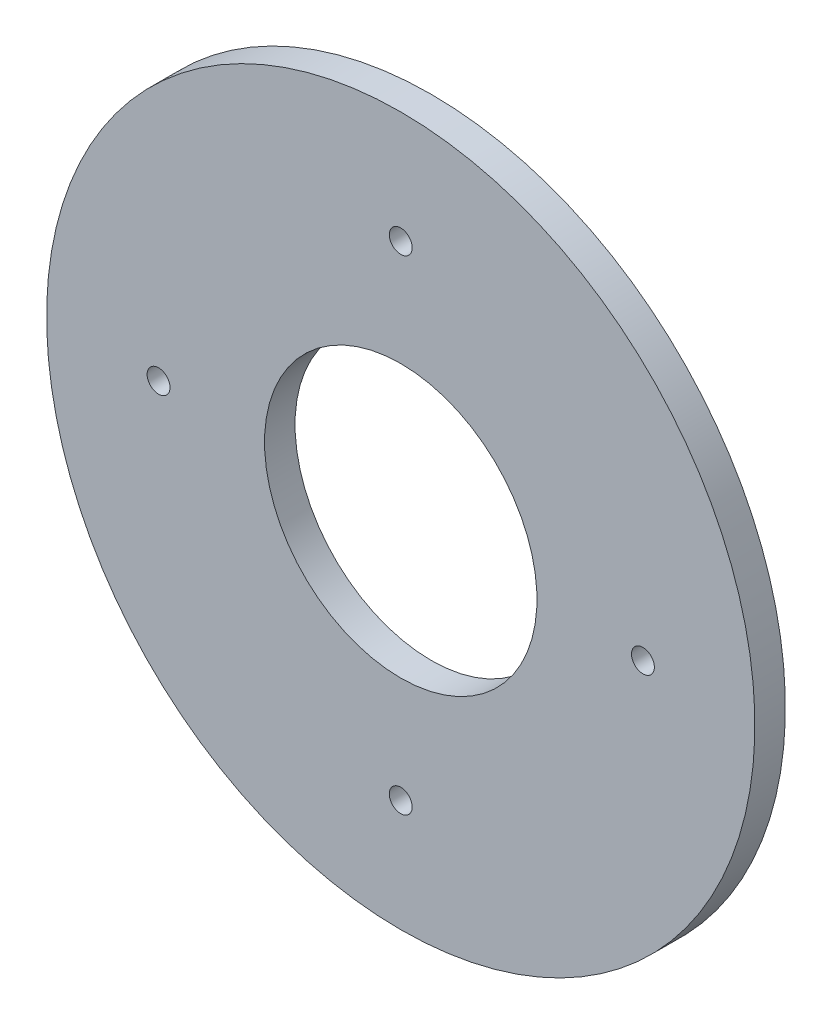
ISO-10303-21;
HEADER;
FILE_DESCRIPTION(('STEP AP214'),'2;1');
FILE_NAME('part.step','',(''),(''),'','','');
FILE_SCHEMA(('AUTOMOTIVE_DESIGN { 1 0 10303 214 1 1 1 1 }'));
ENDSEC;
DATA;
#1=APPLICATION_CONTEXT('core data for automotive mechanical design processes');
#2=APPLICATION_PROTOCOL_DEFINITION('international standard','automotive_design',2000,#1);
#3=PRODUCT_CONTEXT('',#1,'mechanical');
#4=PRODUCT('Part','Part','',(#3));
#5=PRODUCT_RELATED_PRODUCT_CATEGORY('part','',(#4));
#6=PRODUCT_DEFINITION_FORMATION('','',#4);
#7=PRODUCT_DEFINITION_CONTEXT('part definition',#1,'design');
#8=PRODUCT_DEFINITION('design','',#6,#7);
#9=PRODUCT_DEFINITION_SHAPE('','',#8);
#10=(LENGTH_UNIT() NAMED_UNIT(*) SI_UNIT(.MILLI.,.METRE.));
#11=(NAMED_UNIT(*) PLANE_ANGLE_UNIT() SI_UNIT($,.RADIAN.));
#12=(NAMED_UNIT(*) SI_UNIT($,.STERADIAN.) SOLID_ANGLE_UNIT());
#13=UNCERTAINTY_MEASURE_WITH_UNIT(LENGTH_MEASURE(1.E-05),#10,'distance_accuracy_value','');
#14=(GEOMETRIC_REPRESENTATION_CONTEXT(3) GLOBAL_UNCERTAINTY_ASSIGNED_CONTEXT((#13)) GLOBAL_UNIT_ASSIGNED_CONTEXT((#10,
#11,#12)) REPRESENTATION_CONTEXT('',''));
#15=CARTESIAN_POINT('',(0.,0.,0.));
#16=DIRECTION('',(0.,0.,1.));
#17=DIRECTION('',(1.,0.,0.));
#18=AXIS2_PLACEMENT_3D('',#15,#16,#17);
#19=CARTESIAN_POINT('',(0.,0.,5.6));
#20=DIRECTION('',(0.,0.,-1.));
#21=DIRECTION('',(0.,1.,0.));
#22=AXIS2_PLACEMENT_3D('',#19,#20,#21);
#23=PLANE('',#22);
#24=CARTESIAN_POINT('',(0.,44.45,5.60000000000002));
#25=DIRECTION('',(0.,0.,-1.));
#26=DIRECTION('',(0.,1.,0.));
#27=AXIS2_PLACEMENT_3D('',#24,#25,#26);
#28=CIRCLE('',#27,2.1);
#29=CARTESIAN_POINT('',(0.,46.55,5.60000000000002));
#30=VERTEX_POINT('',#29);
#31=EDGE_CURVE('E56',#30,#30,#28,.T.);
#32=ORIENTED_EDGE('',*,*,#31,.T.);
#33=EDGE_LOOP('',(#32));
#34=FACE_BOUND('',#33,.T.);
#35=CARTESIAN_POINT('',(-44.45,0.,5.60000000000002));
#36=DIRECTION('',(0.,0.,-1.));
#37=DIRECTION('',(0.,1.,0.));
#38=AXIS2_PLACEMENT_3D('',#35,#36,#37);
#39=CIRCLE('',#38,2.10000000000156);
#40=CARTESIAN_POINT('',(-44.45,2.10000000000157,5.60000000000002));
#41=VERTEX_POINT('',#40);
#42=EDGE_CURVE('E78',#41,#41,#39,.T.);
#43=ORIENTED_EDGE('',*,*,#42,.T.);
#44=EDGE_LOOP('',(#43));
#45=FACE_BOUND('',#44,.T.);
#46=CARTESIAN_POINT('',(0.,-44.45,5.60000000000001));
#47=DIRECTION('',(0.,0.,-1.));
#48=DIRECTION('',(0.,1.,0.));
#49=AXIS2_PLACEMENT_3D('',#46,#47,#48);
#50=CIRCLE('',#49,2.1000000000024);
#51=CARTESIAN_POINT('',(0.,-42.3499999999976,5.60000000000001));
#52=VERTEX_POINT('',#51);
#53=EDGE_CURVE('E71',#52,#52,#50,.T.);
#54=ORIENTED_EDGE('',*,*,#53,.T.);
#55=EDGE_LOOP('',(#54));
#56=FACE_BOUND('',#55,.T.);
#57=CARTESIAN_POINT('',(44.45,0.,5.60000000000002));
#58=DIRECTION('',(0.,0.,-1.));
#59=DIRECTION('',(0.,1.,0.));
#60=AXIS2_PLACEMENT_3D('',#57,#58,#59);
#61=CIRCLE('',#60,2.10000000000083);
#62=CARTESIAN_POINT('',(44.45,2.10000000000082,5.60000000000002));
#63=VERTEX_POINT('',#62);
#64=EDGE_CURVE('E65',#63,#63,#61,.T.);
#65=ORIENTED_EDGE('',*,*,#64,.T.);
#66=EDGE_LOOP('',(#65));
#67=FACE_BOUND('',#66,.T.);
#68=CARTESIAN_POINT('',(0.,0.,5.60000000000001));
#69=DIRECTION('',(0.,0.,-1.));
#70=DIRECTION('',(0.,1.,0.));
#71=AXIS2_PLACEMENT_3D('',#68,#69,#70);
#72=CIRCLE('',#71,25.);
#73=CARTESIAN_POINT('',(0.,25.,5.60000000000001));
#74=VERTEX_POINT('',#73);
#75=EDGE_CURVE('E47',#74,#74,#72,.T.);
#76=ORIENTED_EDGE('',*,*,#75,.T.);
#77=EDGE_LOOP('',(#76));
#78=FACE_BOUND('',#77,.T.);
#79=CARTESIAN_POINT('',(0.,0.,5.6));
#80=DIRECTION('',(0.,0.,-1.));
#81=DIRECTION('',(0.,1.,0.));
#82=AXIS2_PLACEMENT_3D('',#79,#80,#81);
#83=CIRCLE('',#82,65.);
#84=CARTESIAN_POINT('',(0.,65.,5.6));
#85=VERTEX_POINT('',#84);
#86=EDGE_CURVE('E43',#85,#85,#83,.T.);
#87=ORIENTED_EDGE('',*,*,#86,.F.);
#88=EDGE_LOOP('',(#87));
#89=FACE_BOUND('',#88,.T.);
#90=ADVANCED_FACE('F38',(#34,#45,#56,#67,#78,#89),#23,.F.);
#91=CARTESIAN_POINT('',(0.,0.,0.));
#92=DIRECTION('',(0.,0.,-1.));
#93=DIRECTION('',(0.,1.,0.));
#94=AXIS2_PLACEMENT_3D('',#91,#92,#93);
#95=PLANE('',#94);
#96=CARTESIAN_POINT('',(0.,44.45,0.));
#97=DIRECTION('',(0.,0.,-1.));
#98=DIRECTION('',(0.,1.,0.));
#99=AXIS2_PLACEMENT_3D('',#96,#97,#98);
#100=CIRCLE('',#99,2.1);
#101=CARTESIAN_POINT('',(0.,46.55,0.));
#102=VERTEX_POINT('',#101);
#103=EDGE_CURVE('E82',#102,#102,#100,.T.);
#104=ORIENTED_EDGE('',*,*,#103,.F.);
#105=EDGE_LOOP('',(#104));
#106=FACE_BOUND('',#105,.T.);
#107=CARTESIAN_POINT('',(-44.45,0.,0.));
#108=DIRECTION('',(0.,0.,-1.));
#109=DIRECTION('',(0.,1.,0.));
#110=AXIS2_PLACEMENT_3D('',#107,#108,#109);
#111=CIRCLE('',#110,2.10000000000156);
#112=CARTESIAN_POINT('',(-44.45,2.10000000000157,0.));
#113=VERTEX_POINT('',#112);
#114=EDGE_CURVE('E75',#113,#113,#111,.T.);
#115=ORIENTED_EDGE('',*,*,#114,.F.);
#116=EDGE_LOOP('',(#115));
#117=FACE_BOUND('',#116,.T.);
#118=CARTESIAN_POINT('',(0.,-44.45,0.));
#119=DIRECTION('',(0.,0.,-1.));
#120=DIRECTION('',(0.,1.,0.));
#121=AXIS2_PLACEMENT_3D('',#118,#119,#120);
#122=CIRCLE('',#121,2.1000000000024);
#123=CARTESIAN_POINT('',(0.,-42.3499999999976,0.));
#124=VERTEX_POINT('',#123);
#125=EDGE_CURVE('E69',#124,#124,#122,.T.);
#126=ORIENTED_EDGE('',*,*,#125,.F.);
#127=EDGE_LOOP('',(#126));
#128=FACE_BOUND('',#127,.T.);
#129=CARTESIAN_POINT('',(44.45,0.,0.));
#130=DIRECTION('',(0.,0.,-1.));
#131=DIRECTION('',(0.,1.,0.));
#132=AXIS2_PLACEMENT_3D('',#129,#130,#131);
#133=CIRCLE('',#132,2.10000000000083);
#134=CARTESIAN_POINT('',(44.45,2.10000000000082,0.));
#135=VERTEX_POINT('',#134);
#136=EDGE_CURVE('E59',#135,#135,#133,.T.);
#137=ORIENTED_EDGE('',*,*,#136,.F.);
#138=EDGE_LOOP('',(#137));
#139=FACE_BOUND('',#138,.T.);
#140=CARTESIAN_POINT('',(0.,0.,0.));
#141=DIRECTION('',(0.,0.,-1.));
#142=DIRECTION('',(0.,1.,0.));
#143=AXIS2_PLACEMENT_3D('',#140,#141,#142);
#144=CIRCLE('',#143,25.);
#145=CARTESIAN_POINT('',(0.,25.,0.));
#146=VERTEX_POINT('',#145);
#147=EDGE_CURVE('E51',#146,#146,#144,.T.);
#148=ORIENTED_EDGE('',*,*,#147,.F.);
#149=EDGE_LOOP('',(#148));
#150=FACE_BOUND('',#149,.T.);
#151=CARTESIAN_POINT('',(0.,0.,0.));
#152=DIRECTION('',(0.,0.,-1.));
#153=DIRECTION('',(0.,1.,0.));
#154=AXIS2_PLACEMENT_3D('',#151,#152,#153);
#155=CIRCLE('',#154,65.);
#156=CARTESIAN_POINT('',(0.,65.,0.));
#157=VERTEX_POINT('',#156);
#158=EDGE_CURVE('E11',#157,#157,#155,.T.);
#159=ORIENTED_EDGE('',*,*,#158,.T.);
#160=EDGE_LOOP('',(#159));
#161=FACE_BOUND('',#160,.T.);
#162=ADVANCED_FACE('F94',(#106,#117,#128,#139,#150,#161),#95,.T.);
#163=CARTESIAN_POINT('',(0.,0.,0.));
#164=DIRECTION('',(0.,0.,-1.));
#165=DIRECTION('',(0.,1.,0.));
#166=AXIS2_PLACEMENT_3D('',#163,#164,#165);
#167=CYLINDRICAL_SURFACE('',#166,65.);
#168=ORIENTED_EDGE('',*,*,#86,.T.);
#169=EDGE_LOOP('',(#168));
#170=FACE_BOUND('',#169,.T.);
#171=ORIENTED_EDGE('',*,*,#158,.F.);
#172=EDGE_LOOP('',(#171));
#173=FACE_BOUND('',#172,.T.);
#174=ADVANCED_FACE('F97',(#170,#173),#167,.T.);
#175=CARTESIAN_POINT('',(0.,0.,5.60000000000001));
#176=DIRECTION('',(0.,0.,-1.));
#177=DIRECTION('',(0.,1.,0.));
#178=AXIS2_PLACEMENT_3D('',#175,#176,#177);
#179=CYLINDRICAL_SURFACE('',#178,25.);
#180=ORIENTED_EDGE('',*,*,#75,.F.);
#181=EDGE_LOOP('',(#180));
#182=FACE_BOUND('',#181,.T.);
#183=ORIENTED_EDGE('',*,*,#147,.T.);
#184=EDGE_LOOP('',(#183));
#185=FACE_BOUND('',#184,.T.);
#186=ADVANCED_FACE('F107',(#182,#185),#179,.F.);
#187=CARTESIAN_POINT('',(44.45,0.,5.60000000000002));
#188=DIRECTION('',(0.,0.,-1.));
#189=DIRECTION('',(0.,1.,0.));
#190=AXIS2_PLACEMENT_3D('',#187,#188,#189);
#191=CYLINDRICAL_SURFACE('',#190,2.10000000000083);
#192=ORIENTED_EDGE('',*,*,#64,.F.);
#193=EDGE_LOOP('',(#192));
#194=FACE_BOUND('',#193,.T.);
#195=ORIENTED_EDGE('',*,*,#136,.T.);
#196=EDGE_LOOP('',(#195));
#197=FACE_BOUND('',#196,.T.);
#198=ADVANCED_FACE('F109',(#194,#197),#191,.F.);
#199=CARTESIAN_POINT('',(0.,-44.45,5.60000000000001));
#200=DIRECTION('',(0.,0.,-1.));
#201=DIRECTION('',(0.,1.,0.));
#202=AXIS2_PLACEMENT_3D('',#199,#200,#201);
#203=CYLINDRICAL_SURFACE('',#202,2.1000000000024);
#204=ORIENTED_EDGE('',*,*,#53,.F.);
#205=EDGE_LOOP('',(#204));
#206=FACE_BOUND('',#205,.T.);
#207=ORIENTED_EDGE('',*,*,#125,.T.);
#208=EDGE_LOOP('',(#207));
#209=FACE_BOUND('',#208,.T.);
#210=ADVANCED_FACE('F116',(#206,#209),#203,.F.);
#211=CARTESIAN_POINT('',(-44.45,0.,5.60000000000002));
#212=DIRECTION('',(0.,0.,-1.));
#213=DIRECTION('',(0.,1.,0.));
#214=AXIS2_PLACEMENT_3D('',#211,#212,#213);
#215=CYLINDRICAL_SURFACE('',#214,2.10000000000156);
#216=ORIENTED_EDGE('',*,*,#42,.F.);
#217=EDGE_LOOP('',(#216));
#218=FACE_BOUND('',#217,.T.);
#219=ORIENTED_EDGE('',*,*,#114,.T.);
#220=EDGE_LOOP('',(#219));
#221=FACE_BOUND('',#220,.T.);
#222=ADVANCED_FACE('F136',(#218,#221),#215,.F.);
#223=CARTESIAN_POINT('',(0.,44.45,5.60000000000002));
#224=DIRECTION('',(0.,0.,-1.));
#225=DIRECTION('',(0.,1.,0.));
#226=AXIS2_PLACEMENT_3D('',#223,#224,#225);
#227=CYLINDRICAL_SURFACE('',#226,2.1);
#228=ORIENTED_EDGE('',*,*,#31,.F.);
#229=EDGE_LOOP('',(#228));
#230=FACE_BOUND('',#229,.T.);
#231=ORIENTED_EDGE('',*,*,#103,.T.);
#232=EDGE_LOOP('',(#231));
#233=FACE_BOUND('',#232,.T.);
#234=ADVANCED_FACE('F92',(#230,#233),#227,.F.);
#235=CLOSED_SHELL('',(#90,#162,#174,#186,#198,#210,#222,#234));
#236=MANIFOLD_SOLID_BREP('B2',#235);
#237=ADVANCED_BREP_SHAPE_REPRESENTATION('',(#18,#236),#14);
#238=SHAPE_DEFINITION_REPRESENTATION(#9,#237);
ENDSEC;
END-ISO-10303-21;
